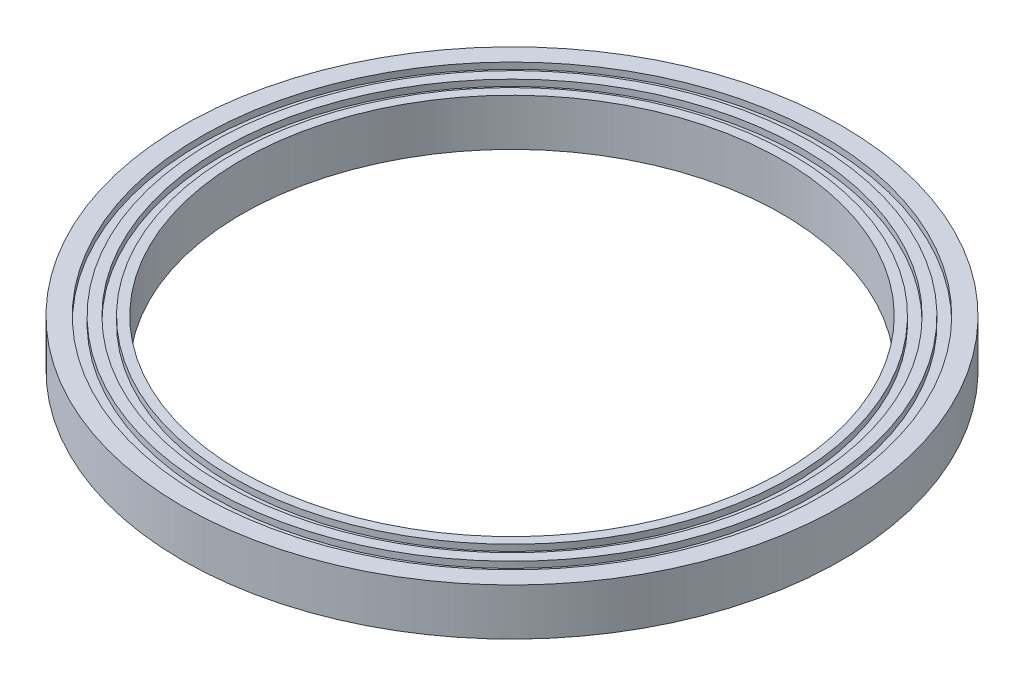
ISO-10303-21;
HEADER;
FILE_DESCRIPTION(('STEP AP214'),'2;1');
FILE_NAME('part.step','',(''),(''),'','','');
FILE_SCHEMA(('AUTOMOTIVE_DESIGN { 1 0 10303 214 1 1 1 1 }'));
ENDSEC;
DATA;
#1=APPLICATION_CONTEXT('core data for automotive mechanical design processes');
#2=APPLICATION_PROTOCOL_DEFINITION('international standard','automotive_design',2000,#1);
#3=PRODUCT_CONTEXT('',#1,'mechanical');
#4=PRODUCT('Part','Part','',(#3));
#5=PRODUCT_RELATED_PRODUCT_CATEGORY('part','',(#4));
#6=PRODUCT_DEFINITION_FORMATION('','',#4);
#7=PRODUCT_DEFINITION_CONTEXT('part definition',#1,'design');
#8=PRODUCT_DEFINITION('design','',#6,#7);
#9=PRODUCT_DEFINITION_SHAPE('','',#8);
#10=(LENGTH_UNIT() NAMED_UNIT(*) SI_UNIT(.MILLI.,.METRE.));
#11=(NAMED_UNIT(*) PLANE_ANGLE_UNIT() SI_UNIT($,.RADIAN.));
#12=(NAMED_UNIT(*) SI_UNIT($,.STERADIAN.) SOLID_ANGLE_UNIT());
#13=UNCERTAINTY_MEASURE_WITH_UNIT(LENGTH_MEASURE(1.E-05),#10,'distance_accuracy_value','');
#14=(GEOMETRIC_REPRESENTATION_CONTEXT(3) GLOBAL_UNCERTAINTY_ASSIGNED_CONTEXT((#13)) GLOBAL_UNIT_ASSIGNED_CONTEXT((#10,
#11,#12)) REPRESENTATION_CONTEXT('',''));
#15=CARTESIAN_POINT('',(0.,0.,0.));
#16=DIRECTION('',(0.,0.,1.));
#17=DIRECTION('',(1.,0.,0.));
#18=AXIS2_PLACEMENT_3D('',#15,#16,#17);
#19=CARTESIAN_POINT('',(0.,1500.,0.));
#20=DIRECTION('',(0.,1.,0.));
#21=DIRECTION('',(0.,0.,1.));
#22=AXIS2_PLACEMENT_3D('',#19,#20,#21);
#23=PLANE('',#22);
#24=CARTESIAN_POINT('',(0.,1500.,0.));
#25=DIRECTION('',(0.,1.,0.));
#26=DIRECTION('',(0.,0.,1.));
#27=AXIS2_PLACEMENT_3D('',#24,#25,#26);
#28=CIRCLE('',#27,9275.);
#29=CARTESIAN_POINT('',(0.,1500.,9275.));
#30=VERTEX_POINT('',#29);
#31=EDGE_CURVE('E82',#30,#30,#28,.T.);
#32=ORIENTED_EDGE('',*,*,#31,.F.);
#33=EDGE_LOOP('',(#32));
#34=FACE_BOUND('',#33,.T.);
#35=CARTESIAN_POINT('',(0.,1500.,0.));
#36=DIRECTION('',(0.,1.,0.));
#37=DIRECTION('',(0.,0.,1.));
#38=AXIS2_PLACEMENT_3D('',#35,#36,#37);
#39=CIRCLE('',#38,9610.);
#40=CARTESIAN_POINT('',(0.,1500.,9610.));
#41=VERTEX_POINT('',#40);
#42=EDGE_CURVE('E106',#41,#41,#39,.T.);
#43=ORIENTED_EDGE('',*,*,#42,.T.);
#44=EDGE_LOOP('',(#43));
#45=FACE_BOUND('',#44,.T.);
#46=ADVANCED_FACE('F43',(#34,#45),#23,.T.);
#47=CARTESIAN_POINT('',(0.,1500.,0.));
#48=DIRECTION('',(0.,1.,0.));
#49=DIRECTION('',(0.,0.,1.));
#50=AXIS2_PLACEMENT_3D('',#47,#48,#49);
#51=CIRCLE('',#50,8645.);
#52=CARTESIAN_POINT('',(0.,1500.,8645.));
#53=VERTEX_POINT('',#52);
#54=EDGE_CURVE('E73',#53,#53,#51,.T.);
#55=ORIENTED_EDGE('',*,*,#54,.F.);
#56=EDGE_LOOP('',(#55));
#57=FACE_BOUND('',#56,.T.);
#58=CARTESIAN_POINT('',(0.,1500.,0.));
#59=DIRECTION('',(0.,1.,0.));
#60=DIRECTION('',(0.,0.,1.));
#61=AXIS2_PLACEMENT_3D('',#58,#59,#60);
#62=CIRCLE('',#61,8945.);
#63=CARTESIAN_POINT('',(0.,1500.,8945.));
#64=VERTEX_POINT('',#63);
#65=EDGE_CURVE('E90',#64,#64,#62,.T.);
#66=ORIENTED_EDGE('',*,*,#65,.T.);
#67=EDGE_LOOP('',(#66));
#68=FACE_BOUND('',#67,.T.);
#69=ADVANCED_FACE('F133',(#57,#68),#23,.T.);
#70=CARTESIAN_POINT('',(0.,1500.,0.));
#71=DIRECTION('',(0.,1.,0.));
#72=DIRECTION('',(0.,0.,1.));
#73=AXIS2_PLACEMENT_3D('',#70,#71,#72);
#74=CIRCLE('',#73,9945.);
#75=CARTESIAN_POINT('',(0.,1500.,9945.));
#76=VERTEX_POINT('',#75);
#77=EDGE_CURVE('E98',#76,#76,#74,.T.);
#78=ORIENTED_EDGE('',*,*,#77,.F.);
#79=EDGE_LOOP('',(#78));
#80=FACE_BOUND('',#79,.T.);
#81=CARTESIAN_POINT('',(0.,1500.,0.));
#82=DIRECTION('',(0.,1.,0.));
#83=DIRECTION('',(0.,0.,1.));
#84=AXIS2_PLACEMENT_3D('',#81,#82,#83);
#85=CIRCLE('',#84,10540.);
#86=CARTESIAN_POINT('',(0.,1500.,10540.));
#87=VERTEX_POINT('',#86);
#88=EDGE_CURVE('E10',#87,#87,#85,.T.);
#89=ORIENTED_EDGE('',*,*,#88,.T.);
#90=EDGE_LOOP('',(#89));
#91=FACE_BOUND('',#90,.T.);
#92=ADVANCED_FACE('F130',(#80,#91),#23,.T.);
#93=CARTESIAN_POINT('',(0.,1500.,0.));
#94=DIRECTION('',(0.,-1.,0.));
#95=DIRECTION('',(0.,0.,-1.));
#96=AXIS2_PLACEMENT_3D('',#93,#94,#95);
#97=CYLINDRICAL_SURFACE('',#96,10540.);
#98=ORIENTED_EDGE('',*,*,#88,.F.);
#99=EDGE_LOOP('',(#98));
#100=FACE_BOUND('',#99,.T.);
#101=CARTESIAN_POINT('',(0.,0.,0.));
#102=DIRECTION('',(0.,1.,0.));
#103=DIRECTION('',(0.,0.,1.));
#104=AXIS2_PLACEMENT_3D('',#101,#102,#103);
#105=CIRCLE('',#104,10540.);
#106=CARTESIAN_POINT('',(0.,0.,10540.));
#107=VERTEX_POINT('',#106);
#108=EDGE_CURVE('E47',#107,#107,#105,.T.);
#109=ORIENTED_EDGE('',*,*,#108,.T.);
#110=EDGE_LOOP('',(#109));
#111=FACE_BOUND('',#110,.T.);
#112=ADVANCED_FACE('F132',(#100,#111),#97,.T.);
#113=CARTESIAN_POINT('',(0.,0.,0.));
#114=DIRECTION('',(0.,1.,0.));
#115=DIRECTION('',(0.,0.,1.));
#116=AXIS2_PLACEMENT_3D('',#113,#114,#115);
#117=PLANE('',#116);
#118=CARTESIAN_POINT('',(0.,0.,0.));
#119=DIRECTION('',(0.,-1.,0.));
#120=DIRECTION('',(0.,0.,-1.));
#121=AXIS2_PLACEMENT_3D('',#118,#119,#120);
#122=CIRCLE('',#121,9945.);
#123=CARTESIAN_POINT('',(0.,0.,-9945.));
#124=VERTEX_POINT('',#123);
#125=EDGE_CURVE('E58',#124,#124,#122,.T.);
#126=ORIENTED_EDGE('',*,*,#125,.F.);
#127=EDGE_LOOP('',(#126));
#128=FACE_BOUND('',#127,.T.);
#129=ORIENTED_EDGE('',*,*,#108,.F.);
#130=EDGE_LOOP('',(#129));
#131=FACE_BOUND('',#130,.T.);
#132=ADVANCED_FACE('F45',(#128,#131),#117,.F.);
#133=CARTESIAN_POINT('',(0.,500.,0.));
#134=DIRECTION('',(0.,-1.,0.));
#135=DIRECTION('',(0.,0.,-1.));
#136=AXIS2_PLACEMENT_3D('',#133,#134,#135);
#137=CYLINDRICAL_SURFACE('',#136,9945.);
#138=CARTESIAN_POINT('',(0.,500.,0.));
#139=DIRECTION('',(0.,-1.,0.));
#140=DIRECTION('',(0.,0.,-1.));
#141=AXIS2_PLACEMENT_3D('',#138,#139,#140);
#142=CIRCLE('',#141,9945.);
#143=CARTESIAN_POINT('',(0.,500.,-9945.));
#144=VERTEX_POINT('',#143);
#145=EDGE_CURVE('E56',#144,#144,#142,.T.);
#146=ORIENTED_EDGE('',*,*,#145,.F.);
#147=EDGE_LOOP('',(#146));
#148=FACE_BOUND('',#147,.T.);
#149=ORIENTED_EDGE('',*,*,#125,.T.);
#150=EDGE_LOOP('',(#149));
#151=FACE_BOUND('',#150,.T.);
#152=ADVANCED_FACE('F179',(#148,#151),#137,.F.);
#153=CARTESIAN_POINT('',(0.,500.,0.));
#154=DIRECTION('',(0.,-1.,0.));
#155=DIRECTION('',(0.,0.,-1.));
#156=AXIS2_PLACEMENT_3D('',#153,#154,#155);
#157=PLANE('',#156);
#158=CARTESIAN_POINT('',(0.,500.,0.));
#159=DIRECTION('',(0.,-1.,0.));
#160=DIRECTION('',(0.,0.,-1.));
#161=AXIS2_PLACEMENT_3D('',#158,#159,#160);
#162=CIRCLE('',#161,8945.);
#163=CARTESIAN_POINT('',(0.,500.,-8945.));
#164=VERTEX_POINT('',#163);
#165=EDGE_CURVE('E62',#164,#164,#162,.T.);
#166=ORIENTED_EDGE('',*,*,#165,.F.);
#167=EDGE_LOOP('',(#166));
#168=FACE_BOUND('',#167,.T.);
#169=ORIENTED_EDGE('',*,*,#145,.T.);
#170=EDGE_LOOP('',(#169));
#171=FACE_BOUND('',#170,.T.);
#172=ADVANCED_FACE('F173',(#168,#171),#157,.T.);
#173=CARTESIAN_POINT('',(0.,0.,0.));
#174=DIRECTION('',(0.,1.,0.));
#175=DIRECTION('',(0.,0.,1.));
#176=AXIS2_PLACEMENT_3D('',#173,#174,#175);
#177=PLANE('',#176);
#178=CARTESIAN_POINT('',(0.,0.,0.));
#179=DIRECTION('',(0.,1.,0.));
#180=DIRECTION('',(0.,0.,1.));
#181=AXIS2_PLACEMENT_3D('',#178,#179,#180);
#182=CIRCLE('',#181,8945.);
#183=CARTESIAN_POINT('',(0.,0.,8945.));
#184=VERTEX_POINT('',#183);
#185=EDGE_CURVE('E69',#184,#184,#182,.T.);
#186=ORIENTED_EDGE('',*,*,#185,.F.);
#187=EDGE_LOOP('',(#186));
#188=FACE_BOUND('',#187,.T.);
#189=CARTESIAN_POINT('',(0.,0.,0.));
#190=DIRECTION('',(0.,1.,0.));
#191=DIRECTION('',(0.,0.,1.));
#192=AXIS2_PLACEMENT_3D('',#189,#190,#191);
#193=CIRCLE('',#192,8645.);
#194=CARTESIAN_POINT('',(0.,0.,8645.));
#195=VERTEX_POINT('',#194);
#196=EDGE_CURVE('E74',#195,#195,#193,.T.);
#197=ORIENTED_EDGE('',*,*,#196,.T.);
#198=EDGE_LOOP('',(#197));
#199=FACE_BOUND('',#198,.T.);
#200=ADVANCED_FACE('F170',(#188,#199),#177,.F.);
#201=CARTESIAN_POINT('',(0.,1500.,0.));
#202=DIRECTION('',(0.,-1.,0.));
#203=DIRECTION('',(0.,0.,-1.));
#204=AXIS2_PLACEMENT_3D('',#201,#202,#203);
#205=CYLINDRICAL_SURFACE('',#204,8945.);
#206=ORIENTED_EDGE('',*,*,#165,.T.);
#207=EDGE_LOOP('',(#206));
#208=FACE_BOUND('',#207,.T.);
#209=ORIENTED_EDGE('',*,*,#185,.T.);
#210=EDGE_LOOP('',(#209));
#211=FACE_BOUND('',#210,.T.);
#212=ADVANCED_FACE('F168',(#208,#211),#205,.T.);
#213=CARTESIAN_POINT('',(0.,1500.,0.));
#214=DIRECTION('',(0.,-1.,0.));
#215=DIRECTION('',(0.,0.,-1.));
#216=AXIS2_PLACEMENT_3D('',#213,#214,#215);
#217=CYLINDRICAL_SURFACE('',#216,8645.);
#218=ORIENTED_EDGE('',*,*,#54,.T.);
#219=EDGE_LOOP('',(#218));
#220=FACE_BOUND('',#219,.T.);
#221=ORIENTED_EDGE('',*,*,#196,.F.);
#222=EDGE_LOOP('',(#221));
#223=FACE_BOUND('',#222,.T.);
#224=ADVANCED_FACE('F164',(#220,#223),#217,.F.);
#225=CARTESIAN_POINT('',(0.,1300.,0.));
#226=DIRECTION('',(0.,1.,0.));
#227=DIRECTION('',(0.,0.,1.));
#228=AXIS2_PLACEMENT_3D('',#225,#226,#227);
#229=CYLINDRICAL_SURFACE('',#228,9275.);
#230=CARTESIAN_POINT('',(0.,1300.,0.));
#231=DIRECTION('',(0.,1.,0.));
#232=DIRECTION('',(0.,0.,1.));
#233=AXIS2_PLACEMENT_3D('',#230,#231,#232);
#234=CIRCLE('',#233,9275.);
#235=CARTESIAN_POINT('',(0.,1300.,9275.));
#236=VERTEX_POINT('',#235);
#237=EDGE_CURVE('E78',#236,#236,#234,.T.);
#238=ORIENTED_EDGE('',*,*,#237,.F.);
#239=EDGE_LOOP('',(#238));
#240=FACE_BOUND('',#239,.T.);
#241=ORIENTED_EDGE('',*,*,#31,.T.);
#242=EDGE_LOOP('',(#241));
#243=FACE_BOUND('',#242,.T.);
#244=ADVANCED_FACE('F160',(#240,#243),#229,.F.);
#245=CARTESIAN_POINT('',(0.,1300.,0.));
#246=DIRECTION('',(0.,1.,0.));
#247=DIRECTION('',(0.,0.,1.));
#248=AXIS2_PLACEMENT_3D('',#245,#246,#247);
#249=PLANE('',#248);
#250=CARTESIAN_POINT('',(0.,1300.,0.));
#251=DIRECTION('',(0.,1.,0.));
#252=DIRECTION('',(0.,0.,1.));
#253=AXIS2_PLACEMENT_3D('',#250,#251,#252);
#254=CIRCLE('',#253,8945.);
#255=CARTESIAN_POINT('',(0.,1300.,8945.));
#256=VERTEX_POINT('',#255);
#257=EDGE_CURVE('E86',#256,#256,#254,.T.);
#258=ORIENTED_EDGE('',*,*,#257,.F.);
#259=EDGE_LOOP('',(#258));
#260=FACE_BOUND('',#259,.T.);
#261=ORIENTED_EDGE('',*,*,#237,.T.);
#262=EDGE_LOOP('',(#261));
#263=FACE_BOUND('',#262,.T.);
#264=ADVANCED_FACE('F156',(#260,#263),#249,.T.);
#265=CARTESIAN_POINT('',(0.,1300.,0.));
#266=DIRECTION('',(0.,1.,0.));
#267=DIRECTION('',(0.,0.,1.));
#268=AXIS2_PLACEMENT_3D('',#265,#266,#267);
#269=CYLINDRICAL_SURFACE('',#268,8945.);
#270=ORIENTED_EDGE('',*,*,#257,.T.);
#271=EDGE_LOOP('',(#270));
#272=FACE_BOUND('',#271,.T.);
#273=ORIENTED_EDGE('',*,*,#65,.F.);
#274=EDGE_LOOP('',(#273));
#275=FACE_BOUND('',#274,.T.);
#276=ADVANCED_FACE('F126',(#272,#275),#269,.T.);
#277=CARTESIAN_POINT('',(0.,1300.,0.));
#278=DIRECTION('',(0.,1.,0.));
#279=DIRECTION('',(0.,0.,1.));
#280=AXIS2_PLACEMENT_3D('',#277,#278,#279);
#281=CYLINDRICAL_SURFACE('',#280,9945.);
#282=CARTESIAN_POINT('',(0.,1300.,0.));
#283=DIRECTION('',(0.,1.,0.));
#284=DIRECTION('',(0.,0.,1.));
#285=AXIS2_PLACEMENT_3D('',#282,#283,#284);
#286=CIRCLE('',#285,9945.);
#287=CARTESIAN_POINT('',(0.,1300.,9945.));
#288=VERTEX_POINT('',#287);
#289=EDGE_CURVE('E94',#288,#288,#286,.T.);
#290=ORIENTED_EDGE('',*,*,#289,.F.);
#291=EDGE_LOOP('',(#290));
#292=FACE_BOUND('',#291,.T.);
#293=ORIENTED_EDGE('',*,*,#77,.T.);
#294=EDGE_LOOP('',(#293));
#295=FACE_BOUND('',#294,.T.);
#296=ADVANCED_FACE('F120',(#292,#295),#281,.F.);
#297=CARTESIAN_POINT('',(0.,1300.,0.));
#298=DIRECTION('',(0.,1.,0.));
#299=DIRECTION('',(0.,0.,1.));
#300=AXIS2_PLACEMENT_3D('',#297,#298,#299);
#301=PLANE('',#300);
#302=CARTESIAN_POINT('',(0.,1300.,0.));
#303=DIRECTION('',(0.,1.,0.));
#304=DIRECTION('',(0.,0.,1.));
#305=AXIS2_PLACEMENT_3D('',#302,#303,#304);
#306=CIRCLE('',#305,9610.);
#307=CARTESIAN_POINT('',(0.,1300.,9610.));
#308=VERTEX_POINT('',#307);
#309=EDGE_CURVE('E102',#308,#308,#306,.T.);
#310=ORIENTED_EDGE('',*,*,#309,.F.);
#311=EDGE_LOOP('',(#310));
#312=FACE_BOUND('',#311,.T.);
#313=ORIENTED_EDGE('',*,*,#289,.T.);
#314=EDGE_LOOP('',(#313));
#315=FACE_BOUND('',#314,.T.);
#316=ADVANCED_FACE('F117',(#312,#315),#301,.T.);
#317=CARTESIAN_POINT('',(0.,1300.,0.));
#318=DIRECTION('',(0.,1.,0.));
#319=DIRECTION('',(0.,0.,1.));
#320=AXIS2_PLACEMENT_3D('',#317,#318,#319);
#321=CYLINDRICAL_SURFACE('',#320,9610.);
#322=ORIENTED_EDGE('',*,*,#309,.T.);
#323=EDGE_LOOP('',(#322));
#324=FACE_BOUND('',#323,.T.);
#325=ORIENTED_EDGE('',*,*,#42,.F.);
#326=EDGE_LOOP('',(#325));
#327=FACE_BOUND('',#326,.T.);
#328=ADVANCED_FACE('F114',(#324,#327),#321,.T.);
#329=CLOSED_SHELL('',(#46,#69,#92,#112,#132,#152,#172,#200,#212,#224,#244,#264,#276,#296,#316,#328));
#330=MANIFOLD_SOLID_BREP('B2',#329);
#331=ADVANCED_BREP_SHAPE_REPRESENTATION('',(#18,#330),#14);
#332=SHAPE_DEFINITION_REPRESENTATION(#9,#331);
ENDSEC;
END-ISO-10303-21;
